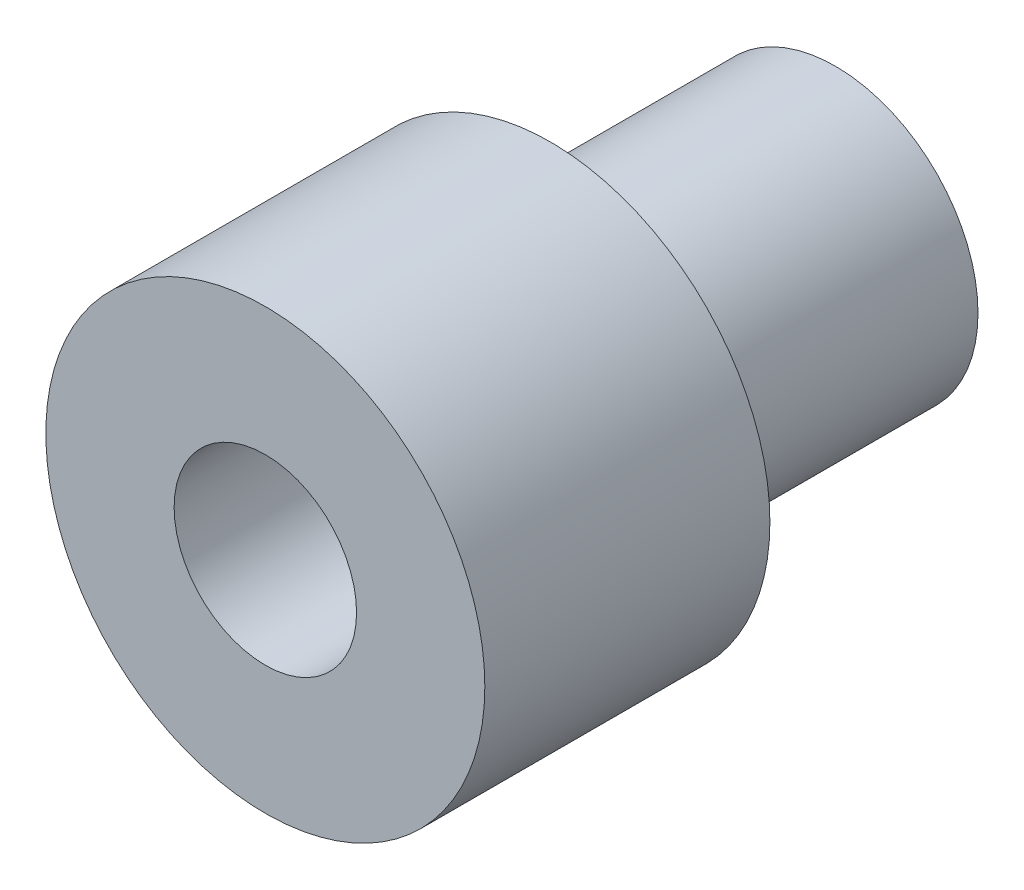
ISO-10303-21;
HEADER;
FILE_DESCRIPTION(('STEP AP214'),'2;1');
FILE_NAME('part.step','',(''),(''),'','','');
FILE_SCHEMA(('AUTOMOTIVE_DESIGN { 1 0 10303 214 1 1 1 1 }'));
ENDSEC;
DATA;
#1=APPLICATION_CONTEXT('core data for automotive mechanical design processes');
#2=APPLICATION_PROTOCOL_DEFINITION('international standard','automotive_design',2000,#1);
#3=PRODUCT_CONTEXT('',#1,'mechanical');
#4=PRODUCT('Part','Part','',(#3));
#5=PRODUCT_RELATED_PRODUCT_CATEGORY('part','',(#4));
#6=PRODUCT_DEFINITION_FORMATION('','',#4);
#7=PRODUCT_DEFINITION_CONTEXT('part definition',#1,'design');
#8=PRODUCT_DEFINITION('design','',#6,#7);
#9=PRODUCT_DEFINITION_SHAPE('','',#8);
#10=(LENGTH_UNIT() NAMED_UNIT(*) SI_UNIT(.MILLI.,.METRE.));
#11=(NAMED_UNIT(*) PLANE_ANGLE_UNIT() SI_UNIT($,.RADIAN.));
#12=(NAMED_UNIT(*) SI_UNIT($,.STERADIAN.) SOLID_ANGLE_UNIT());
#13=UNCERTAINTY_MEASURE_WITH_UNIT(LENGTH_MEASURE(1.E-05),#10,'distance_accuracy_value','');
#14=(GEOMETRIC_REPRESENTATION_CONTEXT(3) GLOBAL_UNCERTAINTY_ASSIGNED_CONTEXT((#13)) GLOBAL_UNIT_ASSIGNED_CONTEXT((#10,
#11,#12)) REPRESENTATION_CONTEXT('',''));
#15=CARTESIAN_POINT('',(0.,0.,0.));
#16=DIRECTION('',(0.,0.,1.));
#17=DIRECTION('',(1.,0.,0.));
#18=AXIS2_PLACEMENT_3D('',#15,#16,#17);
#19=CARTESIAN_POINT('',(0.,0.,0.));
#20=DIRECTION('',(0.,0.,1.));
#21=DIRECTION('',(1.,0.,0.));
#22=AXIS2_PLACEMENT_3D('',#19,#20,#21);
#23=CYLINDRICAL_SURFACE('',#22,1.6);
#24=CARTESIAN_POINT('',(0.,0.,-10.));
#25=DIRECTION('',(0.,0.,1.));
#26=DIRECTION('',(1.,0.,0.));
#27=AXIS2_PLACEMENT_3D('',#24,#25,#26);
#28=CIRCLE('',#27,1.6);
#29=CARTESIAN_POINT('',(1.6,0.,-10.));
#30=VERTEX_POINT('',#29);
#31=EDGE_CURVE('E52',#30,#30,#28,.T.);
#32=ORIENTED_EDGE('',*,*,#31,.F.);
#33=EDGE_LOOP('',(#32));
#34=FACE_BOUND('',#33,.T.);
#35=CARTESIAN_POINT('',(0.,0.,0.));
#36=DIRECTION('',(0.,0.,1.));
#37=DIRECTION('',(1.,0.,0.));
#38=AXIS2_PLACEMENT_3D('',#35,#36,#37);
#39=CIRCLE('',#38,1.6);
#40=CARTESIAN_POINT('',(1.6,0.,0.));
#41=VERTEX_POINT('',#40);
#42=EDGE_CURVE('E10',#41,#41,#39,.T.);
#43=ORIENTED_EDGE('',*,*,#42,.T.);
#44=EDGE_LOOP('',(#43));
#45=FACE_BOUND('',#44,.T.);
#46=ADVANCED_FACE('F30',(#34,#45),#23,.F.);
#47=CARTESIAN_POINT('',(0.,1.6,0.));
#48=DIRECTION('',(0.,0.,-1.));
#49=DIRECTION('',(-1.,0.,0.));
#50=AXIS2_PLACEMENT_3D('',#47,#48,#49);
#51=PLANE('',#50);
#52=ORIENTED_EDGE('',*,*,#42,.F.);
#53=EDGE_LOOP('',(#52));
#54=FACE_BOUND('',#53,.T.);
#55=CARTESIAN_POINT('',(0.,0.,0.));
#56=DIRECTION('',(0.,0.,1.));
#57=DIRECTION('',(1.,0.,0.));
#58=AXIS2_PLACEMENT_3D('',#55,#56,#57);
#59=CIRCLE('',#58,3.85);
#60=CARTESIAN_POINT('',(3.85,0.,0.));
#61=VERTEX_POINT('',#60);
#62=EDGE_CURVE('E36',#61,#61,#59,.T.);
#63=ORIENTED_EDGE('',*,*,#62,.T.);
#64=EDGE_LOOP('',(#63));
#65=FACE_BOUND('',#64,.T.);
#66=ADVANCED_FACE('F59',(#54,#65),#51,.F.);
#67=CARTESIAN_POINT('',(0.,0.,0.));
#68=DIRECTION('',(0.,0.,1.));
#69=DIRECTION('',(1.,0.,0.));
#70=AXIS2_PLACEMENT_3D('',#67,#68,#69);
#71=CYLINDRICAL_SURFACE('',#70,3.85);
#72=ORIENTED_EDGE('',*,*,#62,.F.);
#73=EDGE_LOOP('',(#72));
#74=FACE_BOUND('',#73,.T.);
#75=CARTESIAN_POINT('',(0.,0.,-5.));
#76=DIRECTION('',(0.,0.,1.));
#77=DIRECTION('',(1.,0.,0.));
#78=AXIS2_PLACEMENT_3D('',#75,#76,#77);
#79=CIRCLE('',#78,3.85);
#80=CARTESIAN_POINT('',(3.85,0.,-5.));
#81=VERTEX_POINT('',#80);
#82=EDGE_CURVE('E40',#81,#81,#79,.T.);
#83=ORIENTED_EDGE('',*,*,#82,.T.);
#84=EDGE_LOOP('',(#83));
#85=FACE_BOUND('',#84,.T.);
#86=ADVANCED_FACE('F63',(#74,#85),#71,.T.);
#87=CARTESIAN_POINT('',(0.,3.85,-5.));
#88=DIRECTION('',(0.,0.,1.));
#89=DIRECTION('',(1.,0.,0.));
#90=AXIS2_PLACEMENT_3D('',#87,#88,#89);
#91=PLANE('',#90);
#92=ORIENTED_EDGE('',*,*,#82,.F.);
#93=EDGE_LOOP('',(#92));
#94=FACE_BOUND('',#93,.T.);
#95=CARTESIAN_POINT('',(0.,0.,-5.));
#96=DIRECTION('',(0.,0.,1.));
#97=DIRECTION('',(1.,0.,0.));
#98=AXIS2_PLACEMENT_3D('',#95,#96,#97);
#99=CIRCLE('',#98,2.5);
#100=CARTESIAN_POINT('',(2.5,0.,-5.));
#101=VERTEX_POINT('',#100);
#102=EDGE_CURVE('E44',#101,#101,#99,.T.);
#103=ORIENTED_EDGE('',*,*,#102,.T.);
#104=EDGE_LOOP('',(#103));
#105=FACE_BOUND('',#104,.T.);
#106=ADVANCED_FACE('F68',(#94,#105),#91,.F.);
#107=CARTESIAN_POINT('',(0.,0.,0.));
#108=DIRECTION('',(0.,0.,1.));
#109=DIRECTION('',(1.,0.,0.));
#110=AXIS2_PLACEMENT_3D('',#107,#108,#109);
#111=CYLINDRICAL_SURFACE('',#110,2.5);
#112=ORIENTED_EDGE('',*,*,#102,.F.);
#113=EDGE_LOOP('',(#112));
#114=FACE_BOUND('',#113,.T.);
#115=CARTESIAN_POINT('',(0.,0.,-10.));
#116=DIRECTION('',(0.,0.,1.));
#117=DIRECTION('',(1.,0.,0.));
#118=AXIS2_PLACEMENT_3D('',#115,#116,#117);
#119=CIRCLE('',#118,2.5);
#120=CARTESIAN_POINT('',(2.5,0.,-10.));
#121=VERTEX_POINT('',#120);
#122=EDGE_CURVE('E49',#121,#121,#119,.T.);
#123=ORIENTED_EDGE('',*,*,#122,.T.);
#124=EDGE_LOOP('',(#123));
#125=FACE_BOUND('',#124,.T.);
#126=ADVANCED_FACE('F74',(#114,#125),#111,.T.);
#127=CARTESIAN_POINT('',(0.,2.5,-10.));
#128=DIRECTION('',(0.,0.,1.));
#129=DIRECTION('',(1.,0.,0.));
#130=AXIS2_PLACEMENT_3D('',#127,#128,#129);
#131=PLANE('',#130);
#132=ORIENTED_EDGE('',*,*,#122,.F.);
#133=EDGE_LOOP('',(#132));
#134=FACE_BOUND('',#133,.T.);
#135=ORIENTED_EDGE('',*,*,#31,.T.);
#136=EDGE_LOOP('',(#135));
#137=FACE_BOUND('',#136,.T.);
#138=ADVANCED_FACE('F56',(#134,#137),#131,.F.);
#139=CLOSED_SHELL('',(#46,#66,#86,#106,#126,#138));
#140=MANIFOLD_SOLID_BREP('B2',#139);
#141=ADVANCED_BREP_SHAPE_REPRESENTATION('',(#18,#140),#14);
#142=SHAPE_DEFINITION_REPRESENTATION(#9,#141);
ENDSEC;
END-ISO-10303-21;
